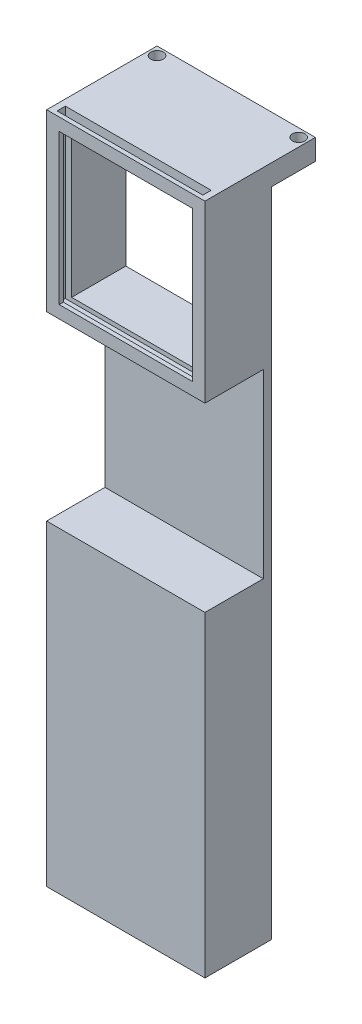
ISO-10303-21;
HEADER;
FILE_DESCRIPTION(('STEP AP214'),'2;1');
FILE_NAME('part.step','',(''),(''),'','','');
FILE_SCHEMA(('AUTOMOTIVE_DESIGN { 1 0 10303 214 1 1 1 1 }'));
ENDSEC;
DATA;
#1=APPLICATION_CONTEXT('core data for automotive mechanical design processes');
#2=APPLICATION_PROTOCOL_DEFINITION('international standard','automotive_design',2000,#1);
#3=PRODUCT_CONTEXT('',#1,'mechanical');
#4=PRODUCT('Part','Part','',(#3));
#5=PRODUCT_RELATED_PRODUCT_CATEGORY('part','',(#4));
#6=PRODUCT_DEFINITION_FORMATION('','',#4);
#7=PRODUCT_DEFINITION_CONTEXT('part definition',#1,'design');
#8=PRODUCT_DEFINITION('design','',#6,#7);
#9=PRODUCT_DEFINITION_SHAPE('','',#8);
#10=(LENGTH_UNIT() NAMED_UNIT(*) SI_UNIT(.MILLI.,.METRE.));
#11=(NAMED_UNIT(*) PLANE_ANGLE_UNIT() SI_UNIT($,.RADIAN.));
#12=(NAMED_UNIT(*) SI_UNIT($,.STERADIAN.) SOLID_ANGLE_UNIT());
#13=UNCERTAINTY_MEASURE_WITH_UNIT(LENGTH_MEASURE(1.E-05),#10,'distance_accuracy_value','');
#14=(GEOMETRIC_REPRESENTATION_CONTEXT(3) GLOBAL_UNCERTAINTY_ASSIGNED_CONTEXT((#13)) GLOBAL_UNIT_ASSIGNED_CONTEXT((#10,
#11,#12)) REPRESENTATION_CONTEXT('',''));
#15=CARTESIAN_POINT('',(0.,0.,0.));
#16=DIRECTION('',(0.,0.,1.));
#17=DIRECTION('',(1.,0.,0.));
#18=AXIS2_PLACEMENT_3D('',#15,#16,#17);
#19=CARTESIAN_POINT('',(34.,-3.,12.));
#20=DIRECTION('',(0.,0.,-1.));
#21=DIRECTION('',(-1.,0.,0.));
#22=AXIS2_PLACEMENT_3D('',#19,#20,#21);
#23=CYLINDRICAL_SURFACE('',#22,1.75);
#24=CARTESIAN_POINT('',(34.,-3.,0.));
#25=DIRECTION('',(0.,0.,1.));
#26=DIRECTION('',(1.,0.,0.));
#27=AXIS2_PLACEMENT_3D('',#24,#25,#26);
#28=CIRCLE('',#27,1.75);
#29=CARTESIAN_POINT('',(35.75,-3.,0.));
#30=VERTEX_POINT('',#29);
#31=EDGE_CURVE('E353',#30,#30,#28,.T.);
#32=ORIENTED_EDGE('',*,*,#31,.F.);
#33=EDGE_LOOP('',(#32));
#34=FACE_BOUND('',#33,.T.);
#35=CARTESIAN_POINT('',(34.,-3.,4.));
#36=DIRECTION('',(0.,0.,1.));
#37=DIRECTION('',(1.,0.,0.));
#38=AXIS2_PLACEMENT_3D('',#35,#36,#37);
#39=CIRCLE('',#38,1.75);
#40=CARTESIAN_POINT('',(35.75,-3.,4.));
#41=VERTEX_POINT('',#40);
#42=EDGE_CURVE('E635',#41,#41,#39,.T.);
#43=ORIENTED_EDGE('',*,*,#42,.T.);
#44=EDGE_LOOP('',(#43));
#45=FACE_BOUND('',#44,.T.);
#46=ADVANCED_FACE('F33',(#34,#45),#23,.F.);
#47=CARTESIAN_POINT('',(0.,-3.,12.));
#48=DIRECTION('',(0.,0.,-1.));
#49=DIRECTION('',(-1.,0.,0.));
#50=AXIS2_PLACEMENT_3D('',#47,#48,#49);
#51=CYLINDRICAL_SURFACE('',#50,1.75);
#52=CARTESIAN_POINT('',(0.,-3.,0.));
#53=DIRECTION('',(0.,0.,1.));
#54=DIRECTION('',(1.,0.,0.));
#55=AXIS2_PLACEMENT_3D('',#52,#53,#54);
#56=CIRCLE('',#55,1.75);
#57=CARTESIAN_POINT('',(1.75,-3.,0.));
#58=VERTEX_POINT('',#57);
#59=EDGE_CURVE('E356',#58,#58,#56,.T.);
#60=ORIENTED_EDGE('',*,*,#59,.F.);
#61=EDGE_LOOP('',(#60));
#62=FACE_BOUND('',#61,.T.);
#63=CARTESIAN_POINT('',(0.,-3.,4.));
#64=DIRECTION('',(0.,0.,1.));
#65=DIRECTION('',(1.,0.,0.));
#66=AXIS2_PLACEMENT_3D('',#63,#64,#65);
#67=CIRCLE('',#66,1.75);
#68=CARTESIAN_POINT('',(1.75,-3.,4.));
#69=VERTEX_POINT('',#68);
#70=EDGE_CURVE('E630',#69,#69,#67,.T.);
#71=ORIENTED_EDGE('',*,*,#70,.T.);
#72=EDGE_LOOP('',(#71));
#73=FACE_BOUND('',#72,.T.);
#74=ADVANCED_FACE('F551',(#62,#73),#51,.F.);
#75=CARTESIAN_POINT('',(1.,153.5,12.));
#76=DIRECTION('',(0.,-1.,0.));
#77=DIRECTION('',(0.,0.,-1.));
#78=AXIS2_PLACEMENT_3D('',#75,#76,#77);
#79=PLANE('',#78);
#80=DIRECTION('',(-1.,0.,0.));
#81=VECTOR('',#80,1.);
#82=CARTESIAN_POINT('',(1.,153.5,15.));
#83=LINE('',#82,#81);
#84=CARTESIAN_POINT('',(33.,153.5,15.));
#85=VERTEX_POINT('',#84);
#86=CARTESIAN_POINT('',(1.,153.5,15.));
#87=VERTEX_POINT('',#86);
#88=EDGE_CURVE('E280',#85,#87,#83,.T.);
#89=ORIENTED_EDGE('',*,*,#88,.F.);
#90=DIRECTION('',(0.,0.,-1.));
#91=VECTOR('',#90,1.);
#92=CARTESIAN_POINT('',(33.,153.5,12.));
#93=LINE('',#92,#91);
#94=CARTESIAN_POINT('',(33.,153.5,16.));
#95=VERTEX_POINT('',#94);
#96=EDGE_CURVE('E457',#95,#85,#93,.T.);
#97=ORIENTED_EDGE('',*,*,#96,.F.);
#98=DIRECTION('',(-1.,0.,0.));
#99=VECTOR('',#98,1.);
#100=CARTESIAN_POINT('',(1.,153.5,16.));
#101=LINE('',#100,#99);
#102=CARTESIAN_POINT('',(1.,153.5,16.));
#103=VERTEX_POINT('',#102);
#104=EDGE_CURVE('E291',#95,#103,#101,.T.);
#105=ORIENTED_EDGE('',*,*,#104,.T.);
#106=DIRECTION('',(0.,0.,-1.));
#107=VECTOR('',#106,1.);
#108=CARTESIAN_POINT('',(1.,153.5,12.));
#109=LINE('',#108,#107);
#110=EDGE_CURVE('E453',#103,#87,#109,.T.);
#111=ORIENTED_EDGE('',*,*,#110,.T.);
#112=EDGE_LOOP('',(#89,#97,#105,#111));
#113=FACE_BOUND('',#112,.T.);
#114=ADVANCED_FACE('F557',(#113),#79,.T.);
#115=CARTESIAN_POINT('',(1.,151.5,12.));
#116=DIRECTION('',(1.,0.,0.));
#117=DIRECTION('',(0.,1.,0.));
#118=AXIS2_PLACEMENT_3D('',#115,#116,#117);
#119=PLANE('',#118);
#120=DIRECTION('',(0.,-1.,0.));
#121=VECTOR('',#120,1.);
#122=CARTESIAN_POINT('',(1.,151.5,15.));
#123=LINE('',#122,#121);
#124=CARTESIAN_POINT('',(1.,117.5,15.));
#125=VERTEX_POINT('',#124);
#126=EDGE_CURVE('E278',#87,#125,#123,.T.);
#127=ORIENTED_EDGE('',*,*,#126,.F.);
#128=ORIENTED_EDGE('',*,*,#110,.F.);
#129=DIRECTION('',(0.,-1.,0.));
#130=VECTOR('',#129,1.);
#131=CARTESIAN_POINT('',(1.,153.5,16.));
#132=LINE('',#131,#130);
#133=CARTESIAN_POINT('',(1.,117.5,16.));
#134=VERTEX_POINT('',#133);
#135=EDGE_CURVE('E282',#103,#134,#132,.T.);
#136=ORIENTED_EDGE('',*,*,#135,.T.);
#137=DIRECTION('',(0.,0.,-1.));
#138=VECTOR('',#137,1.);
#139=CARTESIAN_POINT('',(1.,117.5,12.));
#140=LINE('',#139,#138);
#141=EDGE_CURVE('E449',#134,#125,#140,.T.);
#142=ORIENTED_EDGE('',*,*,#141,.T.);
#143=EDGE_LOOP('',(#127,#128,#136,#142));
#144=FACE_BOUND('',#143,.T.);
#145=ADVANCED_FACE('F737',(#144),#119,.T.);
#146=CARTESIAN_POINT('',(1.,117.5,12.));
#147=DIRECTION('',(0.,1.,0.));
#148=DIRECTION('',(0.,0.,1.));
#149=AXIS2_PLACEMENT_3D('',#146,#147,#148);
#150=PLANE('',#149);
#151=DIRECTION('',(1.,0.,0.));
#152=VECTOR('',#151,1.);
#153=CARTESIAN_POINT('',(1.,117.5,15.));
#154=LINE('',#153,#152);
#155=CARTESIAN_POINT('',(33.,117.5,15.));
#156=VERTEX_POINT('',#155);
#157=EDGE_CURVE('E276',#125,#156,#154,.T.);
#158=ORIENTED_EDGE('',*,*,#157,.F.);
#159=ORIENTED_EDGE('',*,*,#141,.F.);
#160=DIRECTION('',(1.,0.,0.));
#161=VECTOR('',#160,1.);
#162=CARTESIAN_POINT('',(1.,117.5,16.));
#163=LINE('',#162,#161);
#164=CARTESIAN_POINT('',(33.,117.5,16.));
#165=VERTEX_POINT('',#164);
#166=EDGE_CURVE('E285',#134,#165,#163,.T.);
#167=ORIENTED_EDGE('',*,*,#166,.T.);
#168=DIRECTION('',(0.,0.,-1.));
#169=VECTOR('',#168,1.);
#170=CARTESIAN_POINT('',(33.,117.5,12.));
#171=LINE('',#170,#169);
#172=EDGE_CURVE('E445',#165,#156,#171,.T.);
#173=ORIENTED_EDGE('',*,*,#172,.T.);
#174=EDGE_LOOP('',(#158,#159,#167,#173));
#175=FACE_BOUND('',#174,.T.);
#176=ADVANCED_FACE('F745',(#175),#150,.T.);
#177=CARTESIAN_POINT('',(33.,151.5,12.));
#178=DIRECTION('',(-1.,0.,0.));
#179=DIRECTION('',(0.,-1.,0.));
#180=AXIS2_PLACEMENT_3D('',#177,#178,#179);
#181=PLANE('',#180);
#182=DIRECTION('',(0.,1.,0.));
#183=VECTOR('',#182,1.);
#184=CARTESIAN_POINT('',(33.,151.5,15.));
#185=LINE('',#184,#183);
#186=EDGE_CURVE('E11',#156,#85,#185,.T.);
#187=ORIENTED_EDGE('',*,*,#186,.F.);
#188=ORIENTED_EDGE('',*,*,#172,.F.);
#189=DIRECTION('',(0.,1.,0.));
#190=VECTOR('',#189,1.);
#191=CARTESIAN_POINT('',(33.,153.5,16.));
#192=LINE('',#191,#190);
#193=EDGE_CURVE('E288',#165,#95,#192,.T.);
#194=ORIENTED_EDGE('',*,*,#193,.T.);
#195=ORIENTED_EDGE('',*,*,#96,.T.);
#196=EDGE_LOOP('',(#187,#188,#194,#195));
#197=FACE_BOUND('',#196,.T.);
#198=ADVANCED_FACE('F753',(#197),#181,.T.);
#199=CARTESIAN_POINT('',(0.,0.,0.));
#200=DIRECTION('',(0.,0.,1.));
#201=DIRECTION('',(1.,0.,0.));
#202=AXIS2_PLACEMENT_3D('',#199,#200,#201);
#203=PLANE('',#202);
#204=ORIENTED_EDGE('',*,*,#31,.T.);
#205=EDGE_LOOP('',(#204));
#206=FACE_BOUND('',#205,.T.);
#207=DIRECTION('',(-1.,0.,0.));
#208=VECTOR('',#207,1.);
#209=CARTESIAN_POINT('',(1.00000000000001,68.,0.));
#210=LINE('',#209,#208);
#211=CARTESIAN_POINT('',(33.,68.,0.));
#212=VERTEX_POINT('',#211);
#213=CARTESIAN_POINT('',(1.00000000000001,68.,0.));
#214=VERTEX_POINT('',#213);
#215=EDGE_CURVE('E364',#212,#214,#210,.T.);
#216=ORIENTED_EDGE('',*,*,#215,.T.);
#217=DIRECTION('',(0.,-1.,0.));
#218=VECTOR('',#217,1.);
#219=CARTESIAN_POINT('',(1.00000000000001,68.,0.));
#220=LINE('',#219,#218);
#221=CARTESIAN_POINT('',(1.,-1.26794919243113,0.));
#222=VERTEX_POINT('',#221);
#223=EDGE_CURVE('E359',#214,#222,#220,.T.);
#224=ORIENTED_EDGE('',*,*,#223,.T.);
#225=CARTESIAN_POINT('',(0.,-3.,0.));
#226=DIRECTION('',(0.,0.,-1.));
#227=DIRECTION('',(-1.,0.,0.));
#228=AXIS2_PLACEMENT_3D('',#225,#226,#227);
#229=CIRCLE('',#228,2.);
#230=CARTESIAN_POINT('',(1.73205080756888,-2.00000000000001,0.));
#231=VERTEX_POINT('',#230);
#232=EDGE_CURVE('E382',#222,#231,#229,.T.);
#233=ORIENTED_EDGE('',*,*,#232,.T.);
#234=DIRECTION('',(1.,0.,0.));
#235=VECTOR('',#234,1.);
#236=CARTESIAN_POINT('',(32.2679491924311,-2.00000000000001,0.));
#237=LINE('',#236,#235);
#238=CARTESIAN_POINT('',(32.2679491924311,-2.00000000000001,0.));
#239=VERTEX_POINT('',#238);
#240=EDGE_CURVE('E385',#231,#239,#237,.T.);
#241=ORIENTED_EDGE('',*,*,#240,.T.);
#242=CARTESIAN_POINT('',(34.,-3.,0.));
#243=DIRECTION('',(0.,0.,-1.));
#244=DIRECTION('',(1.,0.,0.));
#245=AXIS2_PLACEMENT_3D('',#242,#243,#244);
#246=CIRCLE('',#245,2.);
#247=CARTESIAN_POINT('',(33.,-1.26794919243112,0.));
#248=VERTEX_POINT('',#247);
#249=EDGE_CURVE('E388',#239,#248,#246,.T.);
#250=ORIENTED_EDGE('',*,*,#249,.T.);
#251=DIRECTION('',(0.,1.,0.));
#252=VECTOR('',#251,1.);
#253=CARTESIAN_POINT('',(33.,68.,0.));
#254=LINE('',#253,#252);
#255=EDGE_CURVE('E391',#248,#212,#254,.T.);
#256=ORIENTED_EDGE('',*,*,#255,.T.);
#257=EDGE_LOOP('',(#216,#224,#233,#241,#250,#256));
#258=FACE_BOUND('',#257,.T.);
#259=ORIENTED_EDGE('',*,*,#59,.T.);
#260=EDGE_LOOP('',(#259));
#261=FACE_BOUND('',#260,.T.);
#262=DIRECTION('',(-1.,0.,0.));
#263=VECTOR('',#262,1.);
#264=CARTESIAN_POINT('',(-2.,151.5,0.));
#265=LINE('',#264,#263);
#266=CARTESIAN_POINT('',(1.,151.5,0.));
#267=VERTEX_POINT('',#266);
#268=CARTESIAN_POINT('',(-2.,151.5,0.));
#269=VERTEX_POINT('',#268);
#270=EDGE_CURVE('E333',#267,#269,#265,.T.);
#271=ORIENTED_EDGE('',*,*,#270,.F.);
#272=DIRECTION('',(0.,-1.,0.));
#273=VECTOR('',#272,1.);
#274=CARTESIAN_POINT('',(1.,151.5,0.));
#275=LINE('',#274,#273);
#276=CARTESIAN_POINT('',(1.,117.5,0.));
#277=VERTEX_POINT('',#276);
#278=EDGE_CURVE('E435',#267,#277,#275,.T.);
#279=ORIENTED_EDGE('',*,*,#278,.T.);
#280=DIRECTION('',(1.,0.,0.));
#281=VECTOR('',#280,1.);
#282=CARTESIAN_POINT('',(1.,117.5,0.));
#283=LINE('',#282,#281);
#284=CARTESIAN_POINT('',(33.,117.5,0.));
#285=VERTEX_POINT('',#284);
#286=EDGE_CURVE('E438',#277,#285,#283,.T.);
#287=ORIENTED_EDGE('',*,*,#286,.T.);
#288=DIRECTION('',(0.,1.,0.));
#289=VECTOR('',#288,1.);
#290=CARTESIAN_POINT('',(33.,151.5,0.));
#291=LINE('',#290,#289);
#292=CARTESIAN_POINT('',(33.,151.5,0.));
#293=VERTEX_POINT('',#292);
#294=EDGE_CURVE('E441',#285,#293,#291,.T.);
#295=ORIENTED_EDGE('',*,*,#294,.T.);
#296=DIRECTION('',(-1.,0.,0.));
#297=VECTOR('',#296,1.);
#298=CARTESIAN_POINT('',(36.,151.5,0.));
#299=LINE('',#298,#297);
#300=CARTESIAN_POINT('',(36.,151.5,0.));
#301=VERTEX_POINT('',#300);
#302=EDGE_CURVE('E329',#301,#293,#299,.T.);
#303=ORIENTED_EDGE('',*,*,#302,.F.);
#304=DIRECTION('',(0.,1.,0.));
#305=VECTOR('',#304,1.);
#306=CARTESIAN_POINT('',(36.,151.5,0.));
#307=LINE('',#306,#305);
#308=CARTESIAN_POINT('',(36.,-5.00000000000001,0.));
#309=VERTEX_POINT('',#308);
#310=EDGE_CURVE('E462',#309,#301,#307,.T.);
#311=ORIENTED_EDGE('',*,*,#310,.F.);
#312=DIRECTION('',(1.,0.,0.));
#313=VECTOR('',#312,1.);
#314=CARTESIAN_POINT('',(-2.,-5.,0.));
#315=LINE('',#314,#313);
#316=CARTESIAN_POINT('',(-2.,-5.,0.));
#317=VERTEX_POINT('',#316);
#318=EDGE_CURVE('E409',#317,#309,#315,.T.);
#319=ORIENTED_EDGE('',*,*,#318,.F.);
#320=DIRECTION('',(0.,-1.,0.));
#321=VECTOR('',#320,1.);
#322=CARTESIAN_POINT('',(-2.,151.5,0.));
#323=LINE('',#322,#321);
#324=EDGE_CURVE('E460',#269,#317,#323,.T.);
#325=ORIENTED_EDGE('',*,*,#324,.F.);
#326=EDGE_LOOP('',(#271,#279,#287,#295,#303,#311,#319,#325));
#327=FACE_BOUND('',#326,.T.);
#328=ADVANCED_FACE('F489',(#206,#258,#261,#327),#203,.F.);
#329=CARTESIAN_POINT('',(33.,114.5,12.));
#330=DIRECTION('',(0.,1.,0.));
#331=DIRECTION('',(0.,0.,1.));
#332=AXIS2_PLACEMENT_3D('',#329,#330,#331);
#333=PLANE('',#332);
#334=DIRECTION('',(-1.,0.,0.));
#335=VECTOR('',#334,1.);
#336=CARTESIAN_POINT('',(-2.,114.5,2.));
#337=LINE('',#336,#335);
#338=CARTESIAN_POINT('',(36.,114.5,2.));
#339=VERTEX_POINT('',#338);
#340=CARTESIAN_POINT('',(-2.,114.5,2.));
#341=VERTEX_POINT('',#340);
#342=EDGE_CURVE('E432',#339,#341,#337,.T.);
#343=ORIENTED_EDGE('',*,*,#342,.F.);
#344=DIRECTION('',(0.,0.,-1.));
#345=VECTOR('',#344,1.);
#346=CARTESIAN_POINT('',(36.,114.5,12.));
#347=LINE('',#346,#345);
#348=CARTESIAN_POINT('',(36.,114.5,16.));
#349=VERTEX_POINT('',#348);
#350=EDGE_CURVE('E465',#349,#339,#347,.T.);
#351=ORIENTED_EDGE('',*,*,#350,.F.);
#352=DIRECTION('',(1.,0.,0.));
#353=VECTOR('',#352,1.);
#354=CARTESIAN_POINT('',(36.,114.5,16.));
#355=LINE('',#354,#353);
#356=CARTESIAN_POINT('',(-2.,114.5,16.));
#357=VERTEX_POINT('',#356);
#358=EDGE_CURVE('E303',#357,#349,#355,.T.);
#359=ORIENTED_EDGE('',*,*,#358,.F.);
#360=DIRECTION('',(0.,0.,-1.));
#361=VECTOR('',#360,1.);
#362=CARTESIAN_POINT('',(-2.,114.5,12.));
#363=LINE('',#362,#361);
#364=EDGE_CURVE('E468',#357,#341,#363,.T.);
#365=ORIENTED_EDGE('',*,*,#364,.T.);
#366=EDGE_LOOP('',(#343,#351,#359,#365));
#367=FACE_BOUND('',#366,.T.);
#368=ADVANCED_FACE('F536',(#367),#333,.F.);
#369=CARTESIAN_POINT('',(36.,156.5,12.));
#370=DIRECTION('',(0.,-1.,0.));
#371=DIRECTION('',(0.,0.,-1.));
#372=AXIS2_PLACEMENT_3D('',#369,#370,#371);
#373=PLANE('',#372);
#374=CARTESIAN_POINT('',(0.,156.5,-8.5));
#375=DIRECTION('',(0.,1.,0.));
#376=DIRECTION('',(0.,0.,1.));
#377=AXIS2_PLACEMENT_3D('',#374,#375,#376);
#378=CIRCLE('',#377,1.5);
#379=CARTESIAN_POINT('',(0.,156.5,-7.));
#380=VERTEX_POINT('',#379);
#381=EDGE_CURVE('E626',#380,#380,#378,.T.);
#382=ORIENTED_EDGE('',*,*,#381,.F.);
#383=EDGE_LOOP('',(#382));
#384=FACE_BOUND('',#383,.T.);
#385=CARTESIAN_POINT('',(34.,156.5,-8.49999999999985));
#386=DIRECTION('',(0.,1.,0.));
#387=DIRECTION('',(0.,0.,1.));
#388=AXIS2_PLACEMENT_3D('',#385,#386,#387);
#389=CIRCLE('',#388,1.5);
#390=CARTESIAN_POINT('',(34.,156.5,-6.99999999999984));
#391=VERTEX_POINT('',#390);
#392=EDGE_CURVE('E255',#391,#391,#389,.T.);
#393=ORIENTED_EDGE('',*,*,#392,.F.);
#394=EDGE_LOOP('',(#393));
#395=FACE_BOUND('',#394,.T.);
#396=DIRECTION('',(-1.,0.,0.));
#397=VECTOR('',#396,1.);
#398=CARTESIAN_POINT('',(34.5,156.5,13.));
#399=LINE('',#398,#397);
#400=CARTESIAN_POINT('',(34.5,156.5,13.));
#401=VERTEX_POINT('',#400);
#402=CARTESIAN_POINT('',(-0.5,156.5,13.));
#403=VERTEX_POINT('',#402);
#404=EDGE_CURVE('E261',#401,#403,#399,.T.);
#405=ORIENTED_EDGE('',*,*,#404,.F.);
#406=DIRECTION('',(0.,0.,-1.));
#407=VECTOR('',#406,1.);
#408=CARTESIAN_POINT('',(34.5,156.5,15.));
#409=LINE('',#408,#407);
#410=CARTESIAN_POINT('',(34.5,156.5,15.));
#411=VERTEX_POINT('',#410);
#412=EDGE_CURVE('E48',#411,#401,#409,.T.);
#413=ORIENTED_EDGE('',*,*,#412,.F.);
#414=DIRECTION('',(1.,0.,0.));
#415=VECTOR('',#414,1.);
#416=CARTESIAN_POINT('',(34.5,156.5,15.));
#417=LINE('',#416,#415);
#418=CARTESIAN_POINT('',(-0.5,156.5,15.));
#419=VERTEX_POINT('',#418);
#420=EDGE_CURVE('E249',#419,#411,#417,.T.);
#421=ORIENTED_EDGE('',*,*,#420,.F.);
#422=DIRECTION('',(0.,0.,1.));
#423=VECTOR('',#422,1.);
#424=CARTESIAN_POINT('',(-0.5,156.5,15.));
#425=LINE('',#424,#423);
#426=EDGE_CURVE('E252',#403,#419,#425,.T.);
#427=ORIENTED_EDGE('',*,*,#426,.F.);
#428=EDGE_LOOP('',(#405,#413,#421,#427));
#429=FACE_BOUND('',#428,.T.);
#430=DIRECTION('',(0.,0.,-1.));
#431=VECTOR('',#430,1.);
#432=CARTESIAN_POINT('',(36.,156.5,12.));
#433=LINE('',#432,#431);
#434=CARTESIAN_POINT('',(36.,156.5,16.));
#435=VERTEX_POINT('',#434);
#436=CARTESIAN_POINT('',(36.,156.5,-10.5));
#437=VERTEX_POINT('',#436);
#438=EDGE_CURVE('E472',#435,#437,#433,.T.);
#439=ORIENTED_EDGE('',*,*,#438,.T.);
#440=DIRECTION('',(1.,0.,0.));
#441=VECTOR('',#440,1.);
#442=CARTESIAN_POINT('',(36.,156.5,-10.5));
#443=LINE('',#442,#441);
#444=CARTESIAN_POINT('',(-2.,156.5,-10.5));
#445=VERTEX_POINT('',#444);
#446=EDGE_CURVE('E338',#445,#437,#443,.T.);
#447=ORIENTED_EDGE('',*,*,#446,.F.);
#448=DIRECTION('',(0.,0.,-1.));
#449=VECTOR('',#448,1.);
#450=CARTESIAN_POINT('',(-2.,156.5,12.));
#451=LINE('',#450,#449);
#452=CARTESIAN_POINT('',(-2.00000000000001,156.5,16.));
#453=VERTEX_POINT('',#452);
#454=EDGE_CURVE('E470',#453,#445,#451,.T.);
#455=ORIENTED_EDGE('',*,*,#454,.F.);
#456=DIRECTION('',(-1.,0.,0.));
#457=VECTOR('',#456,1.);
#458=CARTESIAN_POINT('',(36.,156.5,16.));
#459=LINE('',#458,#457);
#460=EDGE_CURVE('E297',#435,#453,#459,.T.);
#461=ORIENTED_EDGE('',*,*,#460,.F.);
#462=EDGE_LOOP('',(#439,#447,#455,#461));
#463=FACE_BOUND('',#462,.T.);
#464=ADVANCED_FACE('F35',(#384,#395,#429,#463),#373,.F.);
#465=CARTESIAN_POINT('',(-2.,151.5,12.));
#466=DIRECTION('',(1.,0.,0.));
#467=DIRECTION('',(0.,1.,0.));
#468=AXIS2_PLACEMENT_3D('',#465,#466,#467);
#469=PLANE('',#468);
#470=ORIENTED_EDGE('',*,*,#454,.T.);
#471=DIRECTION('',(0.,1.,0.));
#472=VECTOR('',#471,1.);
#473=CARTESIAN_POINT('',(-2.,151.5,-10.5));
#474=LINE('',#473,#472);
#475=CARTESIAN_POINT('',(-2.,151.5,-10.5));
#476=VERTEX_POINT('',#475);
#477=EDGE_CURVE('E335',#476,#445,#474,.T.);
#478=ORIENTED_EDGE('',*,*,#477,.F.);
#479=DIRECTION('',(0.,0.,1.));
#480=VECTOR('',#479,1.);
#481=CARTESIAN_POINT('',(-2.,151.5,-10.5));
#482=LINE('',#481,#480);
#483=EDGE_CURVE('E341',#476,#269,#482,.T.);
#484=ORIENTED_EDGE('',*,*,#483,.T.);
#485=ORIENTED_EDGE('',*,*,#324,.T.);
#486=DIRECTION('',(0.,0.,-1.));
#487=VECTOR('',#486,1.);
#488=CARTESIAN_POINT('',(-2.,-5.,12.));
#489=LINE('',#488,#487);
#490=CARTESIAN_POINT('',(-2.,-5.00000000000001,16.));
#491=VERTEX_POINT('',#490);
#492=EDGE_CURVE('E412',#491,#317,#489,.T.);
#493=ORIENTED_EDGE('',*,*,#492,.F.);
#494=DIRECTION('',(0.,-1.,0.));
#495=VECTOR('',#494,1.);
#496=CARTESIAN_POINT('',(-2.,71.,16.));
#497=LINE('',#496,#495);
#498=CARTESIAN_POINT('',(-2.,71.,16.));
#499=VERTEX_POINT('',#498);
#500=EDGE_CURVE('E306',#499,#491,#497,.T.);
#501=ORIENTED_EDGE('',*,*,#500,.F.);
#502=DIRECTION('',(0.,0.,-1.));
#503=VECTOR('',#502,1.);
#504=CARTESIAN_POINT('',(-2.,71.,12.));
#505=LINE('',#504,#503);
#506=CARTESIAN_POINT('',(-2.,71.,2.));
#507=VERTEX_POINT('',#506);
#508=EDGE_CURVE('E415',#499,#507,#505,.T.);
#509=ORIENTED_EDGE('',*,*,#508,.T.);
#510=DIRECTION('',(0.,-1.,0.));
#511=VECTOR('',#510,1.);
#512=CARTESIAN_POINT('',(-2.,114.5,2.));
#513=LINE('',#512,#511);
#514=EDGE_CURVE('E423',#341,#507,#513,.T.);
#515=ORIENTED_EDGE('',*,*,#514,.F.);
#516=ORIENTED_EDGE('',*,*,#364,.F.);
#517=DIRECTION('',(0.,-1.,0.));
#518=VECTOR('',#517,1.);
#519=CARTESIAN_POINT('',(-2.00000000000001,156.5,16.));
#520=LINE('',#519,#518);
#521=EDGE_CURVE('E300',#453,#357,#520,.T.);
#522=ORIENTED_EDGE('',*,*,#521,.F.);
#523=EDGE_LOOP('',(#470,#478,#484,#485,#493,#501,#509,#515,#516,#522));
#524=FACE_BOUND('',#523,.T.);
#525=ADVANCED_FACE('F519',(#524),#469,.F.);
#526=CARTESIAN_POINT('',(36.,151.5,12.));
#527=DIRECTION('',(-1.,0.,0.));
#528=DIRECTION('',(0.,-1.,0.));
#529=AXIS2_PLACEMENT_3D('',#526,#527,#528);
#530=PLANE('',#529);
#531=ORIENTED_EDGE('',*,*,#310,.T.);
#532=DIRECTION('',(0.,0.,1.));
#533=VECTOR('',#532,1.);
#534=CARTESIAN_POINT('',(36.,151.5,-10.5));
#535=LINE('',#534,#533);
#536=CARTESIAN_POINT('',(36.,151.5,-10.5));
#537=VERTEX_POINT('',#536);
#538=EDGE_CURVE('E351',#537,#301,#535,.T.);
#539=ORIENTED_EDGE('',*,*,#538,.F.);
#540=DIRECTION('',(0.,-1.,0.));
#541=VECTOR('',#540,1.);
#542=CARTESIAN_POINT('',(36.,156.5,-10.5));
#543=LINE('',#542,#541);
#544=EDGE_CURVE('E330',#437,#537,#543,.T.);
#545=ORIENTED_EDGE('',*,*,#544,.F.);
#546=ORIENTED_EDGE('',*,*,#438,.F.);
#547=DIRECTION('',(0.,1.,0.));
#548=VECTOR('',#547,1.);
#549=CARTESIAN_POINT('',(36.,156.5,16.));
#550=LINE('',#549,#548);
#551=EDGE_CURVE('E294',#349,#435,#550,.T.);
#552=ORIENTED_EDGE('',*,*,#551,.F.);
#553=ORIENTED_EDGE('',*,*,#350,.T.);
#554=DIRECTION('',(0.,1.,0.));
#555=VECTOR('',#554,1.);
#556=CARTESIAN_POINT('',(36.,114.5,2.));
#557=LINE('',#556,#555);
#558=CARTESIAN_POINT('',(36.,71.,2.));
#559=VERTEX_POINT('',#558);
#560=EDGE_CURVE('E429',#559,#339,#557,.T.);
#561=ORIENTED_EDGE('',*,*,#560,.F.);
#562=DIRECTION('',(0.,0.,-1.));
#563=VECTOR('',#562,1.);
#564=CARTESIAN_POINT('',(36.,71.,12.));
#565=LINE('',#564,#563);
#566=CARTESIAN_POINT('',(36.,71.,16.));
#567=VERTEX_POINT('',#566);
#568=EDGE_CURVE('E418',#567,#559,#565,.T.);
#569=ORIENTED_EDGE('',*,*,#568,.F.);
#570=DIRECTION('',(0.,1.,0.));
#571=VECTOR('',#570,1.);
#572=CARTESIAN_POINT('',(36.,71.,16.));
#573=LINE('',#572,#571);
#574=CARTESIAN_POINT('',(36.,-5.00000000000001,16.));
#575=VERTEX_POINT('',#574);
#576=EDGE_CURVE('E312',#575,#567,#573,.T.);
#577=ORIENTED_EDGE('',*,*,#576,.F.);
#578=DIRECTION('',(0.,0.,-1.));
#579=VECTOR('',#578,1.);
#580=CARTESIAN_POINT('',(36.,-5.00000000000001,12.));
#581=LINE('',#580,#579);
#582=EDGE_CURVE('E420',#575,#309,#581,.T.);
#583=ORIENTED_EDGE('',*,*,#582,.T.);
#584=EDGE_LOOP('',(#531,#539,#545,#546,#552,#553,#561,#569,#577,#583));
#585=FACE_BOUND('',#584,.T.);
#586=ADVANCED_FACE('F508',(#585),#530,.F.);
#587=DIRECTION('',(1.,0.,0.));
#588=VECTOR('',#587,1.);
#589=CARTESIAN_POINT('',(1.,153.5,13.));
#590=LINE('',#589,#588);
#591=CARTESIAN_POINT('',(1.,153.5,13.));
#592=VERTEX_POINT('',#591);
#593=CARTESIAN_POINT('',(33.,153.5,13.));
#594=VERTEX_POINT('',#593);
#595=EDGE_CURVE('E56',#592,#594,#590,.T.);
#596=ORIENTED_EDGE('',*,*,#595,.F.);
#597=CARTESIAN_POINT('',(1.,153.5,-6.50000000000001));
#598=VERTEX_POINT('',#597);
#599=EDGE_CURVE('E452',#592,#598,#109,.T.);
#600=ORIENTED_EDGE('',*,*,#599,.T.);
#601=DIRECTION('',(-1.,0.,0.));
#602=VECTOR('',#601,1.);
#603=CARTESIAN_POINT('',(1.,153.5,-6.50000000000001));
#604=LINE('',#603,#602);
#605=CARTESIAN_POINT('',(33.,153.5,-6.50000000000001));
#606=VERTEX_POINT('',#605);
#607=EDGE_CURVE('E324',#606,#598,#604,.T.);
#608=ORIENTED_EDGE('',*,*,#607,.F.);
#609=EDGE_CURVE('E456',#594,#606,#93,.T.);
#610=ORIENTED_EDGE('',*,*,#609,.F.);
#611=EDGE_LOOP('',(#596,#600,#608,#610));
#612=FACE_BOUND('',#611,.T.);
#613=ADVANCED_FACE('F498',(#612),#79,.T.);
#614=DIRECTION('',(0.,1.,0.));
#615=VECTOR('',#614,1.);
#616=CARTESIAN_POINT('',(1.,151.5,13.));
#617=LINE('',#616,#615);
#618=CARTESIAN_POINT('',(1.,117.5,13.));
#619=VERTEX_POINT('',#618);
#620=EDGE_CURVE('E273',#619,#592,#617,.T.);
#621=ORIENTED_EDGE('',*,*,#620,.F.);
#622=EDGE_CURVE('E448',#619,#277,#140,.T.);
#623=ORIENTED_EDGE('',*,*,#622,.T.);
#624=ORIENTED_EDGE('',*,*,#278,.F.);
#625=DIRECTION('',(0.,0.,1.));
#626=VECTOR('',#625,1.);
#627=CARTESIAN_POINT('',(1.,151.5,-10.5));
#628=LINE('',#627,#626);
#629=CARTESIAN_POINT('',(1.,151.5,-6.5));
#630=VERTEX_POINT('',#629);
#631=EDGE_CURVE('E347',#630,#267,#628,.T.);
#632=ORIENTED_EDGE('',*,*,#631,.F.);
#633=DIRECTION('',(0.,-1.,0.));
#634=VECTOR('',#633,1.);
#635=CARTESIAN_POINT('',(1.,151.5,-6.50000000000001));
#636=LINE('',#635,#634);
#637=EDGE_CURVE('E327',#598,#630,#636,.T.);
#638=ORIENTED_EDGE('',*,*,#637,.F.);
#639=ORIENTED_EDGE('',*,*,#599,.F.);
#640=EDGE_LOOP('',(#621,#623,#624,#632,#638,#639));
#641=FACE_BOUND('',#640,.T.);
#642=ADVANCED_FACE('F494',(#641),#119,.T.);
#643=DIRECTION('',(-1.,0.,0.));
#644=VECTOR('',#643,1.);
#645=CARTESIAN_POINT('',(1.,117.5,13.));
#646=LINE('',#645,#644);
#647=CARTESIAN_POINT('',(33.,117.5,13.));
#648=VERTEX_POINT('',#647);
#649=EDGE_CURVE('E268',#648,#619,#646,.T.);
#650=ORIENTED_EDGE('',*,*,#649,.F.);
#651=EDGE_CURVE('E444',#648,#285,#171,.T.);
#652=ORIENTED_EDGE('',*,*,#651,.T.);
#653=ORIENTED_EDGE('',*,*,#286,.F.);
#654=ORIENTED_EDGE('',*,*,#622,.F.);
#655=EDGE_LOOP('',(#650,#652,#653,#654));
#656=FACE_BOUND('',#655,.T.);
#657=ADVANCED_FACE('F480',(#656),#150,.T.);
#658=DIRECTION('',(0.,-1.,0.));
#659=VECTOR('',#658,1.);
#660=CARTESIAN_POINT('',(33.,151.5,13.));
#661=LINE('',#660,#659);
#662=EDGE_CURVE('E41',#594,#648,#661,.T.);
#663=ORIENTED_EDGE('',*,*,#662,.F.);
#664=ORIENTED_EDGE('',*,*,#609,.T.);
#665=DIRECTION('',(0.,1.,0.));
#666=VECTOR('',#665,1.);
#667=CARTESIAN_POINT('',(33.,151.5,-6.50000000000001));
#668=LINE('',#667,#666);
#669=CARTESIAN_POINT('',(33.,151.5,-6.5));
#670=VERTEX_POINT('',#669);
#671=EDGE_CURVE('E321',#670,#606,#668,.T.);
#672=ORIENTED_EDGE('',*,*,#671,.F.);
#673=DIRECTION('',(0.,0.,1.));
#674=VECTOR('',#673,1.);
#675=CARTESIAN_POINT('',(33.,151.5,-10.5));
#676=LINE('',#675,#674);
#677=EDGE_CURVE('E349',#670,#293,#676,.T.);
#678=ORIENTED_EDGE('',*,*,#677,.T.);
#679=ORIENTED_EDGE('',*,*,#294,.F.);
#680=ORIENTED_EDGE('',*,*,#651,.F.);
#681=EDGE_LOOP('',(#663,#664,#672,#678,#679,#680));
#682=FACE_BOUND('',#681,.T.);
#683=ADVANCED_FACE('F483',(#682),#181,.T.);
#684=CARTESIAN_POINT('',(0.,0.,2.));
#685=DIRECTION('',(0.,0.,1.));
#686=DIRECTION('',(1.,0.,0.));
#687=AXIS2_PLACEMENT_3D('',#684,#685,#686);
#688=PLANE('',#687);
#689=ORIENTED_EDGE('',*,*,#514,.T.);
#690=DIRECTION('',(1.,0.,0.));
#691=VECTOR('',#690,1.);
#692=CARTESIAN_POINT('',(-2.,71.,2.));
#693=LINE('',#692,#691);
#694=EDGE_CURVE('E426',#507,#559,#693,.T.);
#695=ORIENTED_EDGE('',*,*,#694,.T.);
#696=ORIENTED_EDGE('',*,*,#560,.T.);
#697=ORIENTED_EDGE('',*,*,#342,.T.);
#698=EDGE_LOOP('',(#689,#695,#696,#697));
#699=FACE_BOUND('',#698,.T.);
#700=ADVANCED_FACE('F538',(#699),#688,.T.);
#701=CARTESIAN_POINT('',(1.00000000000001,71.,12.));
#702=DIRECTION('',(0.,-1.,0.));
#703=DIRECTION('',(0.,0.,-1.));
#704=AXIS2_PLACEMENT_3D('',#701,#702,#703);
#705=PLANE('',#704);
#706=ORIENTED_EDGE('',*,*,#694,.F.);
#707=ORIENTED_EDGE('',*,*,#508,.F.);
#708=DIRECTION('',(-1.,0.,0.));
#709=VECTOR('',#708,1.);
#710=CARTESIAN_POINT('',(-2.,71.,16.));
#711=LINE('',#710,#709);
#712=EDGE_CURVE('E315',#567,#499,#711,.T.);
#713=ORIENTED_EDGE('',*,*,#712,.F.);
#714=ORIENTED_EDGE('',*,*,#568,.T.);
#715=EDGE_LOOP('',(#706,#707,#713,#714));
#716=FACE_BOUND('',#715,.T.);
#717=ADVANCED_FACE('F540',(#716),#705,.F.);
#718=CARTESIAN_POINT('',(-2.,-5.,12.));
#719=DIRECTION('',(0.,1.,0.));
#720=DIRECTION('',(-1.,0.,0.));
#721=AXIS2_PLACEMENT_3D('',#718,#719,#720);
#722=PLANE('',#721);
#723=ORIENTED_EDGE('',*,*,#318,.T.);
#724=ORIENTED_EDGE('',*,*,#582,.F.);
#725=DIRECTION('',(1.,0.,0.));
#726=VECTOR('',#725,1.);
#727=CARTESIAN_POINT('',(-2.,-5.00000000000001,16.));
#728=LINE('',#727,#726);
#729=EDGE_CURVE('E309',#491,#575,#728,.T.);
#730=ORIENTED_EDGE('',*,*,#729,.F.);
#731=ORIENTED_EDGE('',*,*,#492,.T.);
#732=EDGE_LOOP('',(#723,#724,#730,#731));
#733=FACE_BOUND('',#732,.T.);
#734=ADVANCED_FACE('F513',(#733),#722,.F.);
#735=CARTESIAN_POINT('',(1.00000000000001,68.,12.));
#736=DIRECTION('',(1.,0.,0.));
#737=DIRECTION('',(0.,1.,0.));
#738=AXIS2_PLACEMENT_3D('',#735,#736,#737);
#739=PLANE('',#738);
#740=ORIENTED_EDGE('',*,*,#223,.F.);
#741=DIRECTION('',(0.,0.,-1.));
#742=VECTOR('',#741,1.);
#743=CARTESIAN_POINT('',(1.00000000000001,68.,12.));
#744=LINE('',#743,#742);
#745=CARTESIAN_POINT('',(1.00000000000001,68.,12.));
#746=VERTEX_POINT('',#745);
#747=EDGE_CURVE('E379',#746,#214,#744,.T.);
#748=ORIENTED_EDGE('',*,*,#747,.F.);
#749=DIRECTION('',(0.,-1.,0.));
#750=VECTOR('',#749,1.);
#751=CARTESIAN_POINT('',(1.00000000000001,68.,12.));
#752=LINE('',#751,#750);
#753=CARTESIAN_POINT('',(1.,-1.26794919243113,12.));
#754=VERTEX_POINT('',#753);
#755=EDGE_CURVE('E360',#746,#754,#752,.T.);
#756=ORIENTED_EDGE('',*,*,#755,.T.);
#757=DIRECTION('',(0.,0.,-1.));
#758=VECTOR('',#757,1.);
#759=CARTESIAN_POINT('',(1.,-1.26794919243113,12.));
#760=LINE('',#759,#758);
#761=EDGE_CURVE('E406',#754,#222,#760,.T.);
#762=ORIENTED_EDGE('',*,*,#761,.T.);
#763=EDGE_LOOP('',(#740,#748,#756,#762));
#764=FACE_BOUND('',#763,.T.);
#765=ADVANCED_FACE('F547',(#764),#739,.T.);
#766=CARTESIAN_POINT('',(0.,-3.,12.));
#767=DIRECTION('',(0.,0.,-1.));
#768=DIRECTION('',(-1.,0.,0.));
#769=AXIS2_PLACEMENT_3D('',#766,#767,#768);
#770=CYLINDRICAL_SURFACE('',#769,2.);
#771=ORIENTED_EDGE('',*,*,#232,.F.);
#772=ORIENTED_EDGE('',*,*,#761,.F.);
#773=CARTESIAN_POINT('',(0.,-3.,12.));
#774=DIRECTION('',(0.,0.,-1.));
#775=DIRECTION('',(-1.,0.,0.));
#776=AXIS2_PLACEMENT_3D('',#773,#774,#775);
#777=CIRCLE('',#776,2.);
#778=CARTESIAN_POINT('',(1.73205080756889,-2.00000000000001,12.));
#779=VERTEX_POINT('',#778);
#780=EDGE_CURVE('E363',#754,#779,#777,.T.);
#781=ORIENTED_EDGE('',*,*,#780,.T.);
#782=DIRECTION('',(0.,0.,-1.));
#783=VECTOR('',#782,1.);
#784=CARTESIAN_POINT('',(1.73205080756888,-2.00000000000001,12.));
#785=LINE('',#784,#783);
#786=EDGE_CURVE('E404',#779,#231,#785,.T.);
#787=ORIENTED_EDGE('',*,*,#786,.T.);
#788=EDGE_LOOP('',(#771,#772,#781,#787));
#789=FACE_BOUND('',#788,.T.);
#790=ADVANCED_FACE('F580',(#789),#770,.T.);
#791=CARTESIAN_POINT('',(32.2679491924311,-2.00000000000001,12.));
#792=DIRECTION('',(0.,1.,0.));
#793=DIRECTION('',(-1.,0.,0.));
#794=AXIS2_PLACEMENT_3D('',#791,#792,#793);
#795=PLANE('',#794);
#796=ORIENTED_EDGE('',*,*,#240,.F.);
#797=ORIENTED_EDGE('',*,*,#786,.F.);
#798=DIRECTION('',(1.,0.,0.));
#799=VECTOR('',#798,1.);
#800=CARTESIAN_POINT('',(32.2679491924311,-2.00000000000001,12.));
#801=LINE('',#800,#799);
#802=CARTESIAN_POINT('',(32.2679491924311,-2.00000000000001,12.));
#803=VERTEX_POINT('',#802);
#804=EDGE_CURVE('E367',#779,#803,#801,.T.);
#805=ORIENTED_EDGE('',*,*,#804,.T.);
#806=DIRECTION('',(0.,0.,-1.));
#807=VECTOR('',#806,1.);
#808=CARTESIAN_POINT('',(32.2679491924311,-2.00000000000001,12.));
#809=LINE('',#808,#807);
#810=EDGE_CURVE('E402',#803,#239,#809,.T.);
#811=ORIENTED_EDGE('',*,*,#810,.T.);
#812=EDGE_LOOP('',(#796,#797,#805,#811));
#813=FACE_BOUND('',#812,.T.);
#814=ADVANCED_FACE('F576',(#813),#795,.T.);
#815=CARTESIAN_POINT('',(34.,-3.,12.));
#816=DIRECTION('',(0.,0.,-1.));
#817=DIRECTION('',(-1.,0.,0.));
#818=AXIS2_PLACEMENT_3D('',#815,#816,#817);
#819=CYLINDRICAL_SURFACE('',#818,2.);
#820=ORIENTED_EDGE('',*,*,#249,.F.);
#821=ORIENTED_EDGE('',*,*,#810,.F.);
#822=CARTESIAN_POINT('',(34.,-3.,12.));
#823=DIRECTION('',(0.,0.,-1.));
#824=DIRECTION('',(1.,0.,0.));
#825=AXIS2_PLACEMENT_3D('',#822,#823,#824);
#826=CIRCLE('',#825,2.);
#827=CARTESIAN_POINT('',(33.,-1.26794919243112,12.));
#828=VERTEX_POINT('',#827);
#829=EDGE_CURVE('E370',#803,#828,#826,.T.);
#830=ORIENTED_EDGE('',*,*,#829,.T.);
#831=DIRECTION('',(0.,0.,-1.));
#832=VECTOR('',#831,1.);
#833=CARTESIAN_POINT('',(33.,-1.26794919243112,12.));
#834=LINE('',#833,#832);
#835=EDGE_CURVE('E400',#828,#248,#834,.T.);
#836=ORIENTED_EDGE('',*,*,#835,.T.);
#837=EDGE_LOOP('',(#820,#821,#830,#836));
#838=FACE_BOUND('',#837,.T.);
#839=ADVANCED_FACE('F572',(#838),#819,.T.);
#840=CARTESIAN_POINT('',(33.,68.,12.));
#841=DIRECTION('',(-1.,0.,0.));
#842=DIRECTION('',(0.,-1.,0.));
#843=AXIS2_PLACEMENT_3D('',#840,#841,#842);
#844=PLANE('',#843);
#845=ORIENTED_EDGE('',*,*,#255,.F.);
#846=ORIENTED_EDGE('',*,*,#835,.F.);
#847=DIRECTION('',(0.,1.,0.));
#848=VECTOR('',#847,1.);
#849=CARTESIAN_POINT('',(33.,68.,12.));
#850=LINE('',#849,#848);
#851=CARTESIAN_POINT('',(33.,68.,12.));
#852=VERTEX_POINT('',#851);
#853=EDGE_CURVE('E373',#828,#852,#850,.T.);
#854=ORIENTED_EDGE('',*,*,#853,.T.);
#855=DIRECTION('',(0.,0.,-1.));
#856=VECTOR('',#855,1.);
#857=CARTESIAN_POINT('',(33.,68.,12.));
#858=LINE('',#857,#856);
#859=EDGE_CURVE('E398',#852,#212,#858,.T.);
#860=ORIENTED_EDGE('',*,*,#859,.T.);
#861=EDGE_LOOP('',(#845,#846,#854,#860));
#862=FACE_BOUND('',#861,.T.);
#863=ADVANCED_FACE('F568',(#862),#844,.T.);
#864=CARTESIAN_POINT('',(1.00000000000001,68.,12.));
#865=DIRECTION('',(0.,-1.,0.));
#866=DIRECTION('',(0.,0.,-1.));
#867=AXIS2_PLACEMENT_3D('',#864,#865,#866);
#868=PLANE('',#867);
#869=ORIENTED_EDGE('',*,*,#215,.F.);
#870=ORIENTED_EDGE('',*,*,#859,.F.);
#871=DIRECTION('',(-1.,0.,0.));
#872=VECTOR('',#871,1.);
#873=CARTESIAN_POINT('',(1.00000000000001,68.,12.));
#874=LINE('',#873,#872);
#875=EDGE_CURVE('E376',#852,#746,#874,.T.);
#876=ORIENTED_EDGE('',*,*,#875,.T.);
#877=ORIENTED_EDGE('',*,*,#747,.T.);
#878=EDGE_LOOP('',(#869,#870,#876,#877));
#879=FACE_BOUND('',#878,.T.);
#880=ADVANCED_FACE('F565',(#879),#868,.T.);
#881=CARTESIAN_POINT('',(36.,151.5,-10.5));
#882=DIRECTION('',(0.,1.,0.));
#883=DIRECTION('',(0.,0.,1.));
#884=AXIS2_PLACEMENT_3D('',#881,#882,#883);
#885=PLANE('',#884);
#886=CARTESIAN_POINT('',(0.,151.5,-8.5));
#887=DIRECTION('',(0.,1.,0.));
#888=DIRECTION('',(0.,0.,1.));
#889=AXIS2_PLACEMENT_3D('',#886,#887,#888);
#890=CIRCLE('',#889,1.5);
#891=CARTESIAN_POINT('',(0.,151.5,-7.));
#892=VERTEX_POINT('',#891);
#893=EDGE_CURVE('E262',#892,#892,#890,.T.);
#894=ORIENTED_EDGE('',*,*,#893,.T.);
#895=EDGE_LOOP('',(#894));
#896=FACE_BOUND('',#895,.T.);
#897=CARTESIAN_POINT('',(34.,151.5,-8.49999999999985));
#898=DIRECTION('',(0.,1.,0.));
#899=DIRECTION('',(0.,0.,1.));
#900=AXIS2_PLACEMENT_3D('',#897,#898,#899);
#901=CIRCLE('',#900,1.5);
#902=CARTESIAN_POINT('',(34.,151.5,-6.99999999999984));
#903=VERTEX_POINT('',#902);
#904=EDGE_CURVE('E624',#903,#903,#901,.T.);
#905=ORIENTED_EDGE('',*,*,#904,.T.);
#906=EDGE_LOOP('',(#905));
#907=FACE_BOUND('',#906,.T.);
#908=ORIENTED_EDGE('',*,*,#677,.F.);
#909=DIRECTION('',(-1.,0.,0.));
#910=VECTOR('',#909,1.);
#911=CARTESIAN_POINT('',(36.,151.5,-6.5));
#912=LINE('',#911,#910);
#913=EDGE_CURVE('E318',#670,#630,#912,.T.);
#914=ORIENTED_EDGE('',*,*,#913,.T.);
#915=ORIENTED_EDGE('',*,*,#631,.T.);
#916=ORIENTED_EDGE('',*,*,#270,.T.);
#917=ORIENTED_EDGE('',*,*,#483,.F.);
#918=DIRECTION('',(-1.,0.,0.));
#919=VECTOR('',#918,1.);
#920=CARTESIAN_POINT('',(36.,151.5,-10.5));
#921=LINE('',#920,#919);
#922=EDGE_CURVE('E332',#537,#476,#921,.T.);
#923=ORIENTED_EDGE('',*,*,#922,.F.);
#924=ORIENTED_EDGE('',*,*,#538,.T.);
#925=ORIENTED_EDGE('',*,*,#302,.T.);
#926=EDGE_LOOP('',(#908,#914,#915,#916,#917,#923,#924,#925));
#927=FACE_BOUND('',#926,.T.);
#928=ADVANCED_FACE('F503',(#896,#907,#927),#885,.F.);
#929=CARTESIAN_POINT('',(0.,0.,-10.5));
#930=DIRECTION('',(0.,0.,-1.));
#931=DIRECTION('',(-1.,0.,0.));
#932=AXIS2_PLACEMENT_3D('',#929,#930,#931);
#933=PLANE('',#932);
#934=ORIENTED_EDGE('',*,*,#922,.T.);
#935=ORIENTED_EDGE('',*,*,#477,.T.);
#936=ORIENTED_EDGE('',*,*,#446,.T.);
#937=ORIENTED_EDGE('',*,*,#544,.T.);
#938=EDGE_LOOP('',(#934,#935,#936,#937));
#939=FACE_BOUND('',#938,.T.);
#940=ADVANCED_FACE('F526',(#939),#933,.T.);
#941=CARTESIAN_POINT('',(0.,0.,-6.5));
#942=DIRECTION('',(0.,0.,1.));
#943=DIRECTION('',(1.,0.,0.));
#944=AXIS2_PLACEMENT_3D('',#941,#942,#943);
#945=PLANE('',#944);
#946=ORIENTED_EDGE('',*,*,#607,.T.);
#947=ORIENTED_EDGE('',*,*,#637,.T.);
#948=ORIENTED_EDGE('',*,*,#913,.F.);
#949=ORIENTED_EDGE('',*,*,#671,.T.);
#950=EDGE_LOOP('',(#946,#947,#948,#949));
#951=FACE_BOUND('',#950,.T.);
#952=ADVANCED_FACE('F501',(#951),#945,.T.);
#953=CARTESIAN_POINT('',(0.,0.,12.));
#954=DIRECTION('',(0.,0.,1.));
#955=DIRECTION('',(1.,0.,0.));
#956=AXIS2_PLACEMENT_3D('',#953,#954,#955);
#957=PLANE('',#956);
#958=ORIENTED_EDGE('',*,*,#755,.F.);
#959=ORIENTED_EDGE('',*,*,#875,.F.);
#960=ORIENTED_EDGE('',*,*,#853,.F.);
#961=ORIENTED_EDGE('',*,*,#829,.F.);
#962=ORIENTED_EDGE('',*,*,#804,.F.);
#963=ORIENTED_EDGE('',*,*,#780,.F.);
#964=EDGE_LOOP('',(#958,#959,#960,#961,#962,#963));
#965=FACE_BOUND('',#964,.T.);
#966=ADVANCED_FACE('F599',(#965),#957,.F.);
#967=CARTESIAN_POINT('',(0.,0.,16.));
#968=DIRECTION('',(0.,0.,1.));
#969=DIRECTION('',(1.,0.,0.));
#970=AXIS2_PLACEMENT_3D('',#967,#968,#969);
#971=PLANE('',#970);
#972=ORIENTED_EDGE('',*,*,#500,.T.);
#973=ORIENTED_EDGE('',*,*,#729,.T.);
#974=ORIENTED_EDGE('',*,*,#576,.T.);
#975=ORIENTED_EDGE('',*,*,#712,.T.);
#976=EDGE_LOOP('',(#972,#973,#974,#975));
#977=FACE_BOUND('',#976,.T.);
#978=ADVANCED_FACE('F515',(#977),#971,.T.);
#979=CARTESIAN_POINT('',(0.,0.,16.));
#980=DIRECTION('',(0.,0.,-1.));
#981=DIRECTION('',(-1.,0.,0.));
#982=AXIS2_PLACEMENT_3D('',#979,#980,#981);
#983=PLANE('',#982);
#984=ORIENTED_EDGE('',*,*,#551,.T.);
#985=ORIENTED_EDGE('',*,*,#460,.T.);
#986=ORIENTED_EDGE('',*,*,#521,.T.);
#987=ORIENTED_EDGE('',*,*,#358,.T.);
#988=EDGE_LOOP('',(#984,#985,#986,#987));
#989=FACE_BOUND('',#988,.T.);
#990=ORIENTED_EDGE('',*,*,#135,.F.);
#991=ORIENTED_EDGE('',*,*,#104,.F.);
#992=ORIENTED_EDGE('',*,*,#193,.F.);
#993=ORIENTED_EDGE('',*,*,#166,.F.);
#994=EDGE_LOOP('',(#990,#991,#992,#993));
#995=FACE_BOUND('',#994,.T.);
#996=ADVANCED_FACE('F532',(#989,#995),#983,.F.);
#997=CARTESIAN_POINT('',(34.5,116.5,15.));
#998=DIRECTION('',(1.,0.,0.));
#999=DIRECTION('',(0.,0.,-1.));
#1000=AXIS2_PLACEMENT_3D('',#997,#998,#999);
#1001=PLANE('',#1000);
#1002=ORIENTED_EDGE('',*,*,#412,.T.);
#1003=DIRECTION('',(0.,1.,0.));
#1004=VECTOR('',#1003,1.);
#1005=CARTESIAN_POINT('',(34.5,116.5,13.));
#1006=LINE('',#1005,#1004);
#1007=CARTESIAN_POINT('',(34.5,116.5,13.));
#1008=VERTEX_POINT('',#1007);
#1009=EDGE_CURVE('E227',#1008,#401,#1006,.T.);
#1010=ORIENTED_EDGE('',*,*,#1009,.F.);
#1011=DIRECTION('',(0.,0.,-1.));
#1012=VECTOR('',#1011,1.);
#1013=CARTESIAN_POINT('',(34.5,116.5,15.));
#1014=LINE('',#1013,#1012);
#1015=CARTESIAN_POINT('',(34.5,116.5,15.));
#1016=VERTEX_POINT('',#1015);
#1017=EDGE_CURVE('E231',#1016,#1008,#1014,.T.);
#1018=ORIENTED_EDGE('',*,*,#1017,.F.);
#1019=DIRECTION('',(0.,1.,0.));
#1020=VECTOR('',#1019,1.);
#1021=CARTESIAN_POINT('',(34.5,116.5,15.));
#1022=LINE('',#1021,#1020);
#1023=EDGE_CURVE('E266',#1016,#411,#1022,.T.);
#1024=ORIENTED_EDGE('',*,*,#1023,.T.);
#1025=EDGE_LOOP('',(#1002,#1010,#1018,#1024));
#1026=FACE_BOUND('',#1025,.T.);
#1027=ADVANCED_FACE('F229',(#1026),#1001,.F.);
#1028=CARTESIAN_POINT('',(34.5,116.5,15.));
#1029=DIRECTION('',(0.,0.,1.));
#1030=DIRECTION('',(1.,0.,0.));
#1031=AXIS2_PLACEMENT_3D('',#1028,#1029,#1030);
#1032=PLANE('',#1031);
#1033=ORIENTED_EDGE('',*,*,#88,.T.);
#1034=ORIENTED_EDGE('',*,*,#126,.T.);
#1035=ORIENTED_EDGE('',*,*,#157,.T.);
#1036=ORIENTED_EDGE('',*,*,#186,.T.);
#1037=EDGE_LOOP('',(#1033,#1034,#1035,#1036));
#1038=FACE_BOUND('',#1037,.T.);
#1039=ORIENTED_EDGE('',*,*,#420,.T.);
#1040=ORIENTED_EDGE('',*,*,#1023,.F.);
#1041=DIRECTION('',(1.,0.,0.));
#1042=VECTOR('',#1041,1.);
#1043=CARTESIAN_POINT('',(34.5,116.5,15.));
#1044=LINE('',#1043,#1042);
#1045=CARTESIAN_POINT('',(-0.5,116.5,15.));
#1046=VERTEX_POINT('',#1045);
#1047=EDGE_CURVE('E237',#1046,#1016,#1044,.T.);
#1048=ORIENTED_EDGE('',*,*,#1047,.F.);
#1049=DIRECTION('',(0.,1.,0.));
#1050=VECTOR('',#1049,1.);
#1051=CARTESIAN_POINT('',(-0.5,116.5,15.));
#1052=LINE('',#1051,#1050);
#1053=EDGE_CURVE('E269',#1046,#419,#1052,.T.);
#1054=ORIENTED_EDGE('',*,*,#1053,.T.);
#1055=EDGE_LOOP('',(#1039,#1040,#1048,#1054));
#1056=FACE_BOUND('',#1055,.T.);
#1057=ADVANCED_FACE('F658',(#1038,#1056),#1032,.F.);
#1058=CARTESIAN_POINT('',(-0.5,116.5,15.));
#1059=DIRECTION('',(-1.,0.,0.));
#1060=DIRECTION('',(0.,0.,1.));
#1061=AXIS2_PLACEMENT_3D('',#1058,#1059,#1060);
#1062=PLANE('',#1061);
#1063=ORIENTED_EDGE('',*,*,#426,.T.);
#1064=ORIENTED_EDGE('',*,*,#1053,.F.);
#1065=DIRECTION('',(0.,0.,1.));
#1066=VECTOR('',#1065,1.);
#1067=CARTESIAN_POINT('',(-0.5,116.5,15.));
#1068=LINE('',#1067,#1066);
#1069=CARTESIAN_POINT('',(-0.5,116.5,13.));
#1070=VERTEX_POINT('',#1069);
#1071=EDGE_CURVE('E245',#1070,#1046,#1068,.T.);
#1072=ORIENTED_EDGE('',*,*,#1071,.F.);
#1073=DIRECTION('',(0.,1.,0.));
#1074=VECTOR('',#1073,1.);
#1075=CARTESIAN_POINT('',(-0.5,116.5,13.));
#1076=LINE('',#1075,#1074);
#1077=EDGE_CURVE('E236',#1070,#403,#1076,.T.);
#1078=ORIENTED_EDGE('',*,*,#1077,.T.);
#1079=EDGE_LOOP('',(#1063,#1064,#1072,#1078));
#1080=FACE_BOUND('',#1079,.T.);
#1081=ADVANCED_FACE('F661',(#1080),#1062,.F.);
#1082=CARTESIAN_POINT('',(34.5,116.5,13.));
#1083=DIRECTION('',(0.,0.,-1.));
#1084=DIRECTION('',(-1.,0.,0.));
#1085=AXIS2_PLACEMENT_3D('',#1082,#1083,#1084);
#1086=PLANE('',#1085);
#1087=ORIENTED_EDGE('',*,*,#595,.T.);
#1088=ORIENTED_EDGE('',*,*,#662,.T.);
#1089=ORIENTED_EDGE('',*,*,#649,.T.);
#1090=ORIENTED_EDGE('',*,*,#620,.T.);
#1091=EDGE_LOOP('',(#1087,#1088,#1089,#1090));
#1092=FACE_BOUND('',#1091,.T.);
#1093=ORIENTED_EDGE('',*,*,#404,.T.);
#1094=ORIENTED_EDGE('',*,*,#1077,.F.);
#1095=DIRECTION('',(-1.,0.,0.));
#1096=VECTOR('',#1095,1.);
#1097=CARTESIAN_POINT('',(34.5,116.5,13.));
#1098=LINE('',#1097,#1096);
#1099=EDGE_CURVE('E240',#1008,#1070,#1098,.T.);
#1100=ORIENTED_EDGE('',*,*,#1099,.F.);
#1101=ORIENTED_EDGE('',*,*,#1009,.T.);
#1102=EDGE_LOOP('',(#1093,#1094,#1100,#1101));
#1103=FACE_BOUND('',#1102,.T.);
#1104=ADVANCED_FACE('F241',(#1092,#1103),#1086,.F.);
#1105=CARTESIAN_POINT('',(0.,116.5,0.));
#1106=DIRECTION('',(0.,1.,0.));
#1107=DIRECTION('',(0.,0.,1.));
#1108=AXIS2_PLACEMENT_3D('',#1105,#1106,#1107);
#1109=PLANE('',#1108);
#1110=ORIENTED_EDGE('',*,*,#1017,.T.);
#1111=ORIENTED_EDGE('',*,*,#1099,.T.);
#1112=ORIENTED_EDGE('',*,*,#1071,.T.);
#1113=ORIENTED_EDGE('',*,*,#1047,.T.);
#1114=EDGE_LOOP('',(#1110,#1111,#1112,#1113));
#1115=FACE_BOUND('',#1114,.T.);
#1116=ADVANCED_FACE('F247',(#1115),#1109,.T.);
#1117=CARTESIAN_POINT('',(34.,151.5,-8.49999999999985));
#1118=DIRECTION('',(0.,1.,0.));
#1119=DIRECTION('',(0.,0.,1.));
#1120=AXIS2_PLACEMENT_3D('',#1117,#1118,#1119);
#1121=CYLINDRICAL_SURFACE('',#1120,1.5);
#1122=ORIENTED_EDGE('',*,*,#904,.F.);
#1123=EDGE_LOOP('',(#1122));
#1124=FACE_BOUND('',#1123,.T.);
#1125=ORIENTED_EDGE('',*,*,#392,.T.);
#1126=EDGE_LOOP('',(#1125));
#1127=FACE_BOUND('',#1126,.T.);
#1128=ADVANCED_FACE('F652',(#1124,#1127),#1121,.F.);
#1129=CARTESIAN_POINT('',(0.,151.5,-8.5));
#1130=DIRECTION('',(0.,1.,0.));
#1131=DIRECTION('',(0.,0.,1.));
#1132=AXIS2_PLACEMENT_3D('',#1129,#1130,#1131);
#1133=CYLINDRICAL_SURFACE('',#1132,1.5);
#1134=ORIENTED_EDGE('',*,*,#893,.F.);
#1135=EDGE_LOOP('',(#1134));
#1136=FACE_BOUND('',#1135,.T.);
#1137=ORIENTED_EDGE('',*,*,#381,.T.);
#1138=EDGE_LOOP('',(#1137));
#1139=FACE_BOUND('',#1138,.T.);
#1140=ADVANCED_FACE('F646',(#1136,#1139),#1133,.F.);
#1141=CARTESIAN_POINT('',(0.,-3.,4.));
#1142=DIRECTION('',(0.,0.,1.));
#1143=DIRECTION('',(1.,0.,0.));
#1144=AXIS2_PLACEMENT_3D('',#1141,#1142,#1143);
#1145=PLANE('',#1144);
#1146=ORIENTED_EDGE('',*,*,#70,.F.);
#1147=EDGE_LOOP('',(#1146));
#1148=FACE_BOUND('',#1147,.T.);
#1149=ADVANCED_FACE('F641',(#1148),#1145,.F.);
#1150=CARTESIAN_POINT('',(34.,-3.,4.));
#1151=DIRECTION('',(0.,0.,1.));
#1152=DIRECTION('',(1.,0.,0.));
#1153=AXIS2_PLACEMENT_3D('',#1150,#1151,#1152);
#1154=PLANE('',#1153);
#1155=ORIENTED_EDGE('',*,*,#42,.F.);
#1156=EDGE_LOOP('',(#1155));
#1157=FACE_BOUND('',#1156,.T.);
#1158=ADVANCED_FACE('F639',(#1157),#1154,.F.);
#1159=CLOSED_SHELL('',(#46,#74,#114,#145,#176,#198,#328,#368,#464,#525,#586,#613,#642,#657,#683,
#700,#717,#734,#765,#790,#814,#839,#863,#880,#928,#940,#952,#966,#978,#996,#1027,#1057,#1081,
#1104,#1116,#1128,#1140,#1149,#1158));
#1160=MANIFOLD_SOLID_BREP('B2',#1159);
#1161=ADVANCED_BREP_SHAPE_REPRESENTATION('',(#18,#1160),#14);
#1162=SHAPE_DEFINITION_REPRESENTATION(#9,#1161);
ENDSEC;
END-ISO-10303-21;
